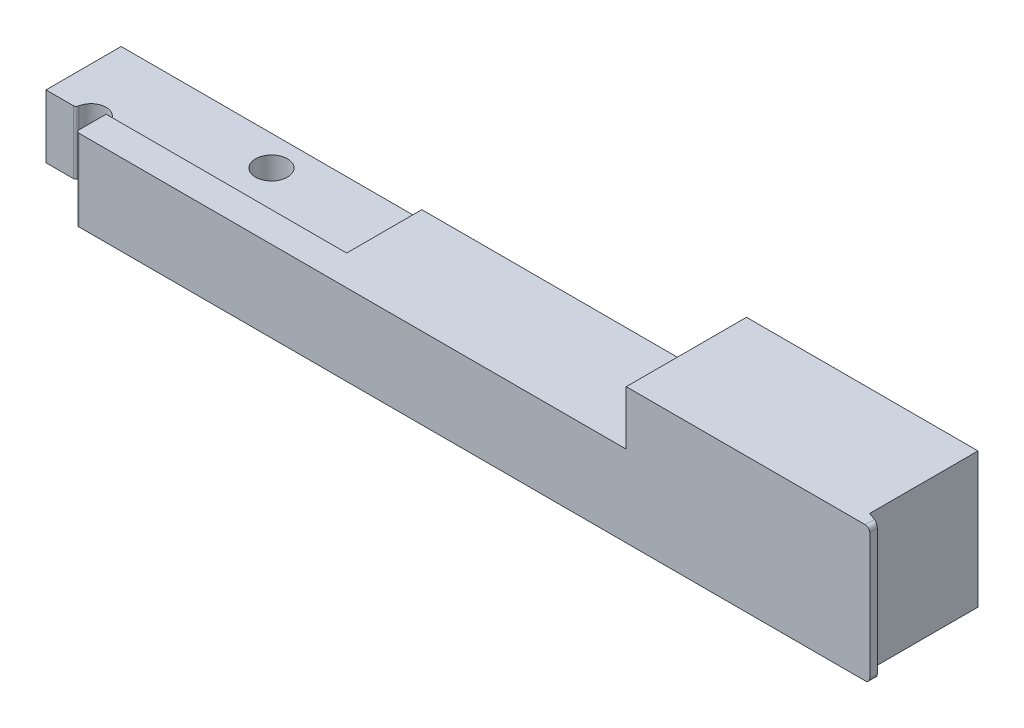
ISO-10303-21;
HEADER;
FILE_DESCRIPTION(('STEP AP214'),'2;1');
FILE_NAME('part.step','',(''),(''),'','','');
FILE_SCHEMA(('AUTOMOTIVE_DESIGN { 1 0 10303 214 1 1 1 1 }'));
ENDSEC;
DATA;
#1=APPLICATION_CONTEXT('core data for automotive mechanical design processes');
#2=APPLICATION_PROTOCOL_DEFINITION('international standard','automotive_design',2000,#1);
#3=PRODUCT_CONTEXT('',#1,'mechanical');
#4=PRODUCT('Part','Part','',(#3));
#5=PRODUCT_RELATED_PRODUCT_CATEGORY('part','',(#4));
#6=PRODUCT_DEFINITION_FORMATION('','',#4);
#7=PRODUCT_DEFINITION_CONTEXT('part definition',#1,'design');
#8=PRODUCT_DEFINITION('design','',#6,#7);
#9=PRODUCT_DEFINITION_SHAPE('','',#8);
#10=(LENGTH_UNIT() NAMED_UNIT(*) SI_UNIT(.MILLI.,.METRE.));
#11=(NAMED_UNIT(*) PLANE_ANGLE_UNIT() SI_UNIT($,.RADIAN.));
#12=(NAMED_UNIT(*) SI_UNIT($,.STERADIAN.) SOLID_ANGLE_UNIT());
#13=UNCERTAINTY_MEASURE_WITH_UNIT(LENGTH_MEASURE(1.E-05),#10,'distance_accuracy_value','');
#14=(GEOMETRIC_REPRESENTATION_CONTEXT(3) GLOBAL_UNCERTAINTY_ASSIGNED_CONTEXT((#13)) GLOBAL_UNIT_ASSIGNED_CONTEXT((#10,
#11,#12)) REPRESENTATION_CONTEXT('',''));
#15=CARTESIAN_POINT('',(0.,0.,0.));
#16=DIRECTION('',(0.,0.,1.));
#17=DIRECTION('',(1.,0.,0.));
#18=AXIS2_PLACEMENT_3D('',#15,#16,#17);
#19=CARTESIAN_POINT('',(0.,0.,-20.));
#20=DIRECTION('',(1.,0.,0.));
#21=DIRECTION('',(0.,0.,-1.));
#22=AXIS2_PLACEMENT_3D('',#19,#20,#21);
#23=PLANE('',#22);
#24=DIRECTION('',(0.,0.,1.));
#25=VECTOR('',#24,1.);
#26=CARTESIAN_POINT('',(0.,1.5,-17.5));
#27=LINE('',#26,#25);
#28=CARTESIAN_POINT('',(0.,1.5,-17.5));
#29=VERTEX_POINT('',#28);
#30=CARTESIAN_POINT('',(0.,1.5,-5.));
#31=VERTEX_POINT('',#30);
#32=EDGE_CURVE('E196',#29,#31,#27,.T.);
#33=ORIENTED_EDGE('',*,*,#32,.T.);
#34=DIRECTION('',(0.,1.,0.));
#35=VECTOR('',#34,1.);
#36=CARTESIAN_POINT('',(0.,-0.00100000000003569,-5.));
#37=LINE('',#36,#35);
#38=CARTESIAN_POINT('',(0.,12.,-5.));
#39=VERTEX_POINT('',#38);
#40=EDGE_CURVE('E325',#31,#39,#37,.T.);
#41=ORIENTED_EDGE('',*,*,#40,.T.);
#42=DIRECTION('',(0.,0.,1.));
#43=VECTOR('',#42,1.);
#44=CARTESIAN_POINT('',(0.,12.,-17.5));
#45=LINE('',#44,#43);
#46=CARTESIAN_POINT('',(0.,12.,-17.5));
#47=VERTEX_POINT('',#46);
#48=EDGE_CURVE('E221',#47,#39,#45,.T.);
#49=ORIENTED_EDGE('',*,*,#48,.F.);
#50=DIRECTION('',(0.,1.,0.));
#51=VECTOR('',#50,1.);
#52=CARTESIAN_POINT('',(0.,0.,-17.5));
#53=LINE('',#52,#51);
#54=EDGE_CURVE('E213',#29,#47,#53,.T.);
#55=ORIENTED_EDGE('',*,*,#54,.F.);
#56=EDGE_LOOP('',(#33,#41,#49,#55));
#57=FACE_BOUND('',#56,.T.);
#58=ADVANCED_FACE('F47',(#57),#23,.F.);
#59=CARTESIAN_POINT('',(30.,-0.00100000000003223,-12.5));
#60=DIRECTION('',(0.,1.,0.));
#61=DIRECTION('',(-1.,0.,0.));
#62=AXIS2_PLACEMENT_3D('',#59,#60,#61);
#63=CYLINDRICAL_SURFACE('',#62,2.65);
#64=CARTESIAN_POINT('',(30.,12.,-12.5));
#65=DIRECTION('',(0.,1.,0.));
#66=DIRECTION('',(0.,0.,1.));
#67=AXIS2_PLACEMENT_3D('',#64,#65,#66);
#68=CIRCLE('',#67,2.65);
#69=CARTESIAN_POINT('',(30.,12.,-9.85));
#70=VERTEX_POINT('',#69);
#71=EDGE_CURVE('E389',#70,#70,#68,.F.);
#72=ORIENTED_EDGE('',*,*,#71,.F.);
#73=EDGE_LOOP('',(#72));
#74=FACE_BOUND('',#73,.T.);
#75=CARTESIAN_POINT('',(30.,1.5,-12.5));
#76=DIRECTION('',(0.,-1.,0.));
#77=DIRECTION('',(1.,0.,0.));
#78=AXIS2_PLACEMENT_3D('',#75,#76,#77);
#79=CIRCLE('',#78,2.65);
#80=CARTESIAN_POINT('',(32.65,1.5,-12.5));
#81=VERTEX_POINT('',#80);
#82=EDGE_CURVE('E475',#81,#81,#79,.F.);
#83=ORIENTED_EDGE('',*,*,#82,.F.);
#84=EDGE_LOOP('',(#83));
#85=FACE_BOUND('',#84,.T.);
#86=ADVANCED_FACE('F418',(#74,#85),#63,.F.);
#87=CARTESIAN_POINT('',(7.5,-0.00100000000003569,-5.));
#88=DIRECTION('',(0.,1.,0.));
#89=DIRECTION('',(-1.,0.,0.));
#90=AXIS2_PLACEMENT_3D('',#87,#88,#89);
#91=CYLINDRICAL_SURFACE('',#90,2.5);
#92=CARTESIAN_POINT('',(7.5,1.5,-5.));
#93=DIRECTION('',(0.,-1.,0.));
#94=DIRECTION('',(1.,0.,0.));
#95=AXIS2_PLACEMENT_3D('',#92,#93,#94);
#96=CIRCLE('',#95,2.5);
#97=CARTESIAN_POINT('',(10.,1.5,-5.));
#98=VERTEX_POINT('',#97);
#99=CARTESIAN_POINT('',(5.03496675704183,1.5,-5.41666666666667));
#100=VERTEX_POINT('',#99);
#101=EDGE_CURVE('E485',#98,#100,#96,.F.);
#102=ORIENTED_EDGE('',*,*,#101,.F.);
#103=DIRECTION('',(0.,1.,0.));
#104=VECTOR('',#103,1.);
#105=CARTESIAN_POINT('',(10.,-0.00100000000003569,-5.));
#106=LINE('',#105,#104);
#107=CARTESIAN_POINT('',(10.,12.,-5.));
#108=VERTEX_POINT('',#107);
#109=EDGE_CURVE('E329',#98,#108,#106,.T.);
#110=ORIENTED_EDGE('',*,*,#109,.T.);
#111=CARTESIAN_POINT('',(7.5,12.,-5.));
#112=DIRECTION('',(0.,1.,0.));
#113=DIRECTION('',(0.,0.,1.));
#114=AXIS2_PLACEMENT_3D('',#111,#112,#113);
#115=CIRCLE('',#114,2.5);
#116=CARTESIAN_POINT('',(5.03496675704183,12.,-5.41666666666667));
#117=VERTEX_POINT('',#116);
#118=EDGE_CURVE('E479',#117,#108,#115,.F.);
#119=ORIENTED_EDGE('',*,*,#118,.F.);
#120=DIRECTION('',(0.,1.,0.));
#121=VECTOR('',#120,1.);
#122=CARTESIAN_POINT('',(5.03496675704183,-0.001000000000036,-5.41666666666667));
#123=LINE('',#122,#121);
#124=EDGE_CURVE('E293',#117,#100,#123,.F.);
#125=ORIENTED_EDGE('',*,*,#124,.T.);
#126=EDGE_LOOP('',(#102,#110,#119,#125));
#127=FACE_BOUND('',#126,.T.);
#128=ADVANCED_FACE('F424',(#127),#91,.F.);
#129=CARTESIAN_POINT('',(0.,-0.00100000000003569,-5.));
#130=DIRECTION('',(0.,0.,-1.));
#131=DIRECTION('',(-1.,0.,0.));
#132=AXIS2_PLACEMENT_3D('',#129,#130,#131);
#133=PLANE('',#132);
#134=DIRECTION('',(1.,0.,0.));
#135=VECTOR('',#134,1.);
#136=CARTESIAN_POINT('',(0.,1.5,-5.));
#137=LINE('',#136,#135);
#138=CARTESIAN_POINT('',(4.54196010845019,1.5,-5.));
#139=VERTEX_POINT('',#138);
#140=EDGE_CURVE('E204',#31,#139,#137,.T.);
#141=ORIENTED_EDGE('',*,*,#140,.T.);
#142=DIRECTION('',(0.,1.,0.));
#143=VECTOR('',#142,1.);
#144=CARTESIAN_POINT('',(4.54196010845019,-0.00100000000003514,-5.));
#145=LINE('',#144,#143);
#146=CARTESIAN_POINT('',(4.54196010845019,12.,-5.));
#147=VERTEX_POINT('',#146);
#148=EDGE_CURVE('E291',#139,#147,#145,.T.);
#149=ORIENTED_EDGE('',*,*,#148,.T.);
#150=DIRECTION('',(1.,0.,0.));
#151=VECTOR('',#150,1.);
#152=CARTESIAN_POINT('',(0.,12.,-5.));
#153=LINE('',#152,#151);
#154=EDGE_CURVE('E457',#39,#147,#153,.T.);
#155=ORIENTED_EDGE('',*,*,#154,.F.);
#156=ORIENTED_EDGE('',*,*,#40,.F.);
#157=EDGE_LOOP('',(#141,#149,#155,#156));
#158=FACE_BOUND('',#157,.T.);
#159=ADVANCED_FACE('F442',(#158),#133,.F.);
#160=CARTESIAN_POINT('',(4.54196010845019,-0.00100000000003606,-5.5));
#161=DIRECTION('',(0.,1.,0.));
#162=DIRECTION('',(-1.,0.,0.));
#163=AXIS2_PLACEMENT_3D('',#160,#161,#162);
#164=CYLINDRICAL_SURFACE('',#163,0.5);
#165=ORIENTED_EDGE('',*,*,#148,.F.);
#166=CARTESIAN_POINT('',(4.54196010845019,1.5,-5.5));
#167=DIRECTION('',(0.,-1.,0.));
#168=DIRECTION('',(1.,0.,0.));
#169=AXIS2_PLACEMENT_3D('',#166,#167,#168);
#170=CIRCLE('',#169,0.5);
#171=EDGE_CURVE('E454',#139,#100,#170,.F.);
#172=ORIENTED_EDGE('',*,*,#171,.T.);
#173=ORIENTED_EDGE('',*,*,#124,.F.);
#174=CARTESIAN_POINT('',(4.54196010845019,12.,-5.5));
#175=DIRECTION('',(0.,1.,0.));
#176=DIRECTION('',(0.,0.,1.));
#177=AXIS2_PLACEMENT_3D('',#174,#175,#176);
#178=CIRCLE('',#177,0.5);
#179=EDGE_CURVE('E11',#117,#147,#178,.F.);
#180=ORIENTED_EDGE('',*,*,#179,.T.);
#181=EDGE_LOOP('',(#165,#172,#173,#180));
#182=FACE_BOUND('',#181,.T.);
#183=ADVANCED_FACE('F440',(#182),#164,.T.);
#184=CARTESIAN_POINT('',(0.,0.,-20.));
#185=DIRECTION('',(0.,-1.,0.));
#186=DIRECTION('',(1.,0.,0.));
#187=AXIS2_PLACEMENT_3D('',#184,#185,#186);
#188=PLANE('',#187);
#189=DIRECTION('',(0.,0.,-1.));
#190=VECTOR('',#189,1.);
#191=CARTESIAN_POINT('',(10.,0.,0.));
#192=LINE('',#191,#190);
#193=CARTESIAN_POINT('',(10.,0.,-0.5));
#194=VERTEX_POINT('',#193);
#195=CARTESIAN_POINT('',(10.,0.,-5.));
#196=VERTEX_POINT('',#195);
#197=EDGE_CURVE('E327',#194,#196,#192,.T.);
#198=ORIENTED_EDGE('',*,*,#197,.T.);
#199=DIRECTION('',(1.,0.,0.));
#200=VECTOR('',#199,1.);
#201=CARTESIAN_POINT('',(0.,0.,-5.));
#202=LINE('',#201,#200);
#203=CARTESIAN_POINT('',(50.,0.,-5.00000000000001));
#204=VERTEX_POINT('',#203);
#205=EDGE_CURVE('E208',#196,#204,#202,.T.);
#206=ORIENTED_EDGE('',*,*,#205,.T.);
#207=DIRECTION('',(0.,0.,-1.));
#208=VECTOR('',#207,1.);
#209=CARTESIAN_POINT('',(50.,0.,-17.5));
#210=LINE('',#209,#208);
#211=CARTESIAN_POINT('',(50.,0.,-17.5));
#212=VERTEX_POINT('',#211);
#213=EDGE_CURVE('E494',#204,#212,#210,.T.);
#214=ORIENTED_EDGE('',*,*,#213,.T.);
#215=DIRECTION('',(1.,0.,0.));
#216=VECTOR('',#215,1.);
#217=CARTESIAN_POINT('',(100.,0.,-17.5));
#218=LINE('',#217,#216);
#219=CARTESIAN_POINT('',(100.,0.,-17.5));
#220=VERTEX_POINT('',#219);
#221=EDGE_CURVE('E337',#212,#220,#218,.T.);
#222=ORIENTED_EDGE('',*,*,#221,.T.);
#223=DIRECTION('',(0.514495755427527,0.,-0.857492925712544));
#224=VECTOR('',#223,1.);
#225=CARTESIAN_POINT('',(100.,0.,-17.5));
#226=LINE('',#225,#224);
#227=CARTESIAN_POINT('',(101.5,0.,-20.));
#228=VERTEX_POINT('',#227);
#229=EDGE_CURVE('E231',#220,#228,#226,.T.);
#230=ORIENTED_EDGE('',*,*,#229,.T.);
#231=DIRECTION('',(1.,0.,0.));
#232=VECTOR('',#231,1.);
#233=CARTESIAN_POINT('',(0.,0.,-20.));
#234=LINE('',#233,#232);
#235=CARTESIAN_POINT('',(140.,0.,-20.));
#236=VERTEX_POINT('',#235);
#237=EDGE_CURVE('E244',#228,#236,#234,.T.);
#238=ORIENTED_EDGE('',*,*,#237,.T.);
#239=DIRECTION('',(0.,0.,1.));
#240=VECTOR('',#239,1.);
#241=CARTESIAN_POINT('',(140.,0.,-20.));
#242=LINE('',#241,#240);
#243=CARTESIAN_POINT('',(140.,0.,-1.97794046853239));
#244=VERTEX_POINT('',#243);
#245=EDGE_CURVE('E222',#236,#244,#242,.T.);
#246=ORIENTED_EDGE('',*,*,#245,.T.);
#247=DIRECTION('',(-0.939692620785909,0.,-0.342020143325667));
#248=VECTOR('',#247,1.);
#249=CARTESIAN_POINT('',(10.5847106977411,0.,-49.0812536335036));
#250=LINE('',#249,#248);
#251=CARTESIAN_POINT('',(141.25,0.,-1.52297767569964));
#252=VERTEX_POINT('',#251);
#253=EDGE_CURVE('E257',#244,#252,#250,.F.);
#254=ORIENTED_EDGE('',*,*,#253,.T.);
#255=DIRECTION('',(0.,0.,1.));
#256=VECTOR('',#255,1.);
#257=CARTESIAN_POINT('',(141.25,0.,-20.));
#258=LINE('',#257,#256);
#259=CARTESIAN_POINT('',(141.25,0.,0.));
#260=VERTEX_POINT('',#259);
#261=EDGE_CURVE('E263',#252,#260,#258,.T.);
#262=ORIENTED_EDGE('',*,*,#261,.T.);
#263=DIRECTION('',(1.,0.,0.));
#264=VECTOR('',#263,1.);
#265=CARTESIAN_POINT('',(0.,0.,0.));
#266=LINE('',#265,#264);
#267=CARTESIAN_POINT('',(10.5,0.,0.));
#268=VERTEX_POINT('',#267);
#269=EDGE_CURVE('E245',#268,#260,#266,.T.);
#270=ORIENTED_EDGE('',*,*,#269,.F.);
#271=CARTESIAN_POINT('',(10.5,0.,-0.5));
#272=DIRECTION('',(0.,-1.,0.));
#273=DIRECTION('',(1.,0.,0.));
#274=AXIS2_PLACEMENT_3D('',#271,#272,#273);
#275=CIRCLE('',#274,0.5);
#276=EDGE_CURVE('E70',#268,#194,#275,.T.);
#277=ORIENTED_EDGE('',*,*,#276,.T.);
#278=EDGE_LOOP('',(#198,#206,#214,#222,#230,#238,#246,#254,#262,#270,#277));
#279=FACE_BOUND('',#278,.T.);
#280=ADVANCED_FACE('F343',(#279),#188,.T.);
#281=CARTESIAN_POINT('',(100.,0.,-17.5));
#282=DIRECTION('',(0.,0.,1.));
#283=DIRECTION('',(1.,0.,0.));
#284=AXIS2_PLACEMENT_3D('',#281,#282,#283);
#285=PLANE('',#284);
#286=DIRECTION('',(0.,-1.,0.));
#287=VECTOR('',#286,1.);
#288=CARTESIAN_POINT('',(50.,1.50000000000001,-17.5));
#289=LINE('',#288,#287);
#290=CARTESIAN_POINT('',(50.,1.50000000000001,-17.5));
#291=VERTEX_POINT('',#290);
#292=EDGE_CURVE('E216',#291,#212,#289,.T.);
#293=ORIENTED_EDGE('',*,*,#292,.F.);
#294=DIRECTION('',(-1.,0.,0.));
#295=VECTOR('',#294,1.);
#296=CARTESIAN_POINT('',(0.,1.5,-17.5));
#297=LINE('',#296,#295);
#298=EDGE_CURVE('E201',#291,#29,#297,.T.);
#299=ORIENTED_EDGE('',*,*,#298,.T.);
#300=ORIENTED_EDGE('',*,*,#54,.T.);
#301=DIRECTION('',(-1.,0.,0.));
#302=VECTOR('',#301,1.);
#303=CARTESIAN_POINT('',(0.,12.,-17.5));
#304=LINE('',#303,#302);
#305=CARTESIAN_POINT('',(50.,12.,-17.5));
#306=VERTEX_POINT('',#305);
#307=EDGE_CURVE('E467',#306,#47,#304,.T.);
#308=ORIENTED_EDGE('',*,*,#307,.F.);
#309=DIRECTION('',(0.,1.,0.));
#310=VECTOR('',#309,1.);
#311=CARTESIAN_POINT('',(50.,12.,-17.5));
#312=LINE('',#311,#310);
#313=CARTESIAN_POINT('',(50.,13.5,-17.5));
#314=VERTEX_POINT('',#313);
#315=EDGE_CURVE('E400',#306,#314,#312,.T.);
#316=ORIENTED_EDGE('',*,*,#315,.T.);
#317=DIRECTION('',(-1.,0.,0.));
#318=VECTOR('',#317,1.);
#319=CARTESIAN_POINT('',(0.,13.5,-17.5));
#320=LINE('',#319,#318);
#321=CARTESIAN_POINT('',(100.,13.5,-17.5));
#322=VERTEX_POINT('',#321);
#323=EDGE_CURVE('E317',#322,#314,#320,.T.);
#324=ORIENTED_EDGE('',*,*,#323,.F.);
#325=DIRECTION('',(0.,1.,0.));
#326=VECTOR('',#325,1.);
#327=CARTESIAN_POINT('',(100.,0.,-17.5));
#328=LINE('',#327,#326);
#329=EDGE_CURVE('E228',#220,#322,#328,.T.);
#330=ORIENTED_EDGE('',*,*,#329,.F.);
#331=ORIENTED_EDGE('',*,*,#221,.F.);
#332=EDGE_LOOP('',(#293,#299,#300,#308,#316,#324,#330,#331));
#333=FACE_BOUND('',#332,.T.);
#334=ADVANCED_FACE('F211',(#333),#285,.F.);
#335=CARTESIAN_POINT('',(0.,22.5,-20.));
#336=DIRECTION('',(0.,-1.,0.));
#337=DIRECTION('',(1.,0.,0.));
#338=AXIS2_PLACEMENT_3D('',#335,#336,#337);
#339=PLANE('',#338);
#340=DIRECTION('',(1.,0.,0.));
#341=VECTOR('',#340,1.);
#342=CARTESIAN_POINT('',(0.,22.5,-20.));
#343=LINE('',#342,#341);
#344=CARTESIAN_POINT('',(101.5,22.5,-20.));
#345=VERTEX_POINT('',#344);
#346=CARTESIAN_POINT('',(140.,22.5,-20.));
#347=VERTEX_POINT('',#346);
#348=EDGE_CURVE('E242',#345,#347,#343,.T.);
#349=ORIENTED_EDGE('',*,*,#348,.F.);
#350=DIRECTION('',(0.,0.,1.));
#351=VECTOR('',#350,1.);
#352=CARTESIAN_POINT('',(101.5,22.5,-20.001));
#353=LINE('',#352,#351);
#354=CARTESIAN_POINT('',(101.5,22.5,0.));
#355=VERTEX_POINT('',#354);
#356=EDGE_CURVE('E315',#345,#355,#353,.T.);
#357=ORIENTED_EDGE('',*,*,#356,.T.);
#358=DIRECTION('',(1.,0.,0.));
#359=VECTOR('',#358,1.);
#360=CARTESIAN_POINT('',(0.,22.5,0.));
#361=LINE('',#360,#359);
#362=CARTESIAN_POINT('',(141.25,22.5,0.));
#363=VERTEX_POINT('',#362);
#364=EDGE_CURVE('E241',#355,#363,#361,.T.);
#365=ORIENTED_EDGE('',*,*,#364,.T.);
#366=DIRECTION('',(0.,0.,1.));
#367=VECTOR('',#366,1.);
#368=CARTESIAN_POINT('',(141.25,22.5,-1.24999999999999));
#369=LINE('',#368,#367);
#370=CARTESIAN_POINT('',(141.25,22.5,-1.52297767569964));
#371=VERTEX_POINT('',#370);
#372=EDGE_CURVE('E280',#363,#371,#369,.F.);
#373=ORIENTED_EDGE('',*,*,#372,.T.);
#374=DIRECTION('',(0.939692620785909,0.,0.342020143325667));
#375=VECTOR('',#374,1.);
#376=CARTESIAN_POINT('',(142.,22.5,-1.24999999999999));
#377=LINE('',#376,#375);
#378=CARTESIAN_POINT('',(140.,22.5,-1.97794046853239));
#379=VERTEX_POINT('',#378);
#380=EDGE_CURVE('E255',#371,#379,#377,.F.);
#381=ORIENTED_EDGE('',*,*,#380,.T.);
#382=DIRECTION('',(0.,0.,1.));
#383=VECTOR('',#382,1.);
#384=CARTESIAN_POINT('',(140.,22.5,-20.));
#385=LINE('',#384,#383);
#386=EDGE_CURVE('E225',#347,#379,#385,.T.);
#387=ORIENTED_EDGE('',*,*,#386,.F.);
#388=EDGE_LOOP('',(#349,#357,#365,#373,#381,#387));
#389=FACE_BOUND('',#388,.T.);
#390=ADVANCED_FACE('F356',(#389),#339,.F.);
#391=CARTESIAN_POINT('',(126.5,11.25,-15.));
#392=DIRECTION('',(0.,0.,-1.));
#393=DIRECTION('',(-1.,0.,0.));
#394=AXIS2_PLACEMENT_3D('',#391,#392,#393);
#395=CYLINDRICAL_SURFACE('',#394,2.99999999999999);
#396=CARTESIAN_POINT('',(126.5,11.25,-20.));
#397=DIRECTION('',(0.,0.,-1.));
#398=DIRECTION('',(-1.,0.,0.));
#399=AXIS2_PLACEMENT_3D('',#396,#397,#398);
#400=CIRCLE('',#399,2.99999999999999);
#401=CARTESIAN_POINT('',(123.5,11.25,-20.));
#402=VERTEX_POINT('',#401);
#403=EDGE_CURVE('E335',#402,#402,#400,.T.);
#404=ORIENTED_EDGE('',*,*,#403,.T.);
#405=EDGE_LOOP('',(#404));
#406=FACE_BOUND('',#405,.T.);
#407=CARTESIAN_POINT('',(126.5,11.25,-16.));
#408=DIRECTION('',(0.,0.,-1.));
#409=DIRECTION('',(-1.,0.,0.));
#410=AXIS2_PLACEMENT_3D('',#407,#408,#409);
#411=CIRCLE('',#410,2.99999999999999);
#412=CARTESIAN_POINT('',(123.5,11.25,-16.));
#413=VERTEX_POINT('',#412);
#414=EDGE_CURVE('E282',#413,#413,#411,.T.);
#415=ORIENTED_EDGE('',*,*,#414,.F.);
#416=EDGE_LOOP('',(#415));
#417=FACE_BOUND('',#416,.T.);
#418=ADVANCED_FACE('F537',(#406,#417),#395,.F.);
#419=CARTESIAN_POINT('',(142.,0.,-20.));
#420=DIRECTION('',(1.,0.,0.));
#421=DIRECTION('',(0.,0.,-1.));
#422=AXIS2_PLACEMENT_3D('',#419,#420,#421);
#423=PLANE('',#422);
#424=DIRECTION('',(0.,1.,0.));
#425=VECTOR('',#424,1.);
#426=CARTESIAN_POINT('',(142.,0.,0.));
#427=LINE('',#426,#425);
#428=CARTESIAN_POINT('',(142.,0.750000000000017,0.));
#429=VERTEX_POINT('',#428);
#430=CARTESIAN_POINT('',(142.,21.75,0.));
#431=VERTEX_POINT('',#430);
#432=EDGE_CURVE('E249',#429,#431,#427,.T.);
#433=ORIENTED_EDGE('',*,*,#432,.F.);
#434=DIRECTION('',(0.,0.,1.));
#435=VECTOR('',#434,1.);
#436=CARTESIAN_POINT('',(142.,0.750000000000017,-20.));
#437=LINE('',#436,#435);
#438=CARTESIAN_POINT('',(142.,0.750000000000017,-1.24999999999999));
#439=VERTEX_POINT('',#438);
#440=EDGE_CURVE('E274',#429,#439,#437,.F.);
#441=ORIENTED_EDGE('',*,*,#440,.T.);
#442=DIRECTION('',(0.,1.,0.));
#443=VECTOR('',#442,1.);
#444=CARTESIAN_POINT('',(142.,0.,-1.24999999999999));
#445=LINE('',#444,#443);
#446=CARTESIAN_POINT('',(142.,21.75,-1.24999999999999));
#447=VERTEX_POINT('',#446);
#448=EDGE_CURVE('E247',#439,#447,#445,.T.);
#449=ORIENTED_EDGE('',*,*,#448,.T.);
#450=DIRECTION('',(0.,0.,1.));
#451=VECTOR('',#450,1.);
#452=CARTESIAN_POINT('',(142.,21.75,0.));
#453=LINE('',#452,#451);
#454=EDGE_CURVE('E271',#447,#431,#453,.T.);
#455=ORIENTED_EDGE('',*,*,#454,.T.);
#456=EDGE_LOOP('',(#433,#441,#449,#455));
#457=FACE_BOUND('',#456,.T.);
#458=ADVANCED_FACE('F369',(#457),#423,.T.);
#459=CARTESIAN_POINT('',(0.,0.,-20.));
#460=DIRECTION('',(0.,0.,-1.));
#461=DIRECTION('',(-1.,0.,0.));
#462=AXIS2_PLACEMENT_3D('',#459,#460,#461);
#463=PLANE('',#462);
#464=ORIENTED_EDGE('',*,*,#403,.F.);
#465=EDGE_LOOP('',(#464));
#466=FACE_BOUND('',#465,.T.);
#467=DIRECTION('',(0.,1.,0.));
#468=VECTOR('',#467,1.);
#469=CARTESIAN_POINT('',(101.5,0.,-20.));
#470=LINE('',#469,#468);
#471=CARTESIAN_POINT('',(101.5,13.5,-20.));
#472=VERTEX_POINT('',#471);
#473=EDGE_CURVE('E223',#228,#472,#470,.T.);
#474=ORIENTED_EDGE('',*,*,#473,.T.);
#475=DIRECTION('',(0.,1.,0.));
#476=VECTOR('',#475,1.);
#477=CARTESIAN_POINT('',(101.5,0.,-20.));
#478=LINE('',#477,#476);
#479=EDGE_CURVE('E385',#472,#345,#478,.T.);
#480=ORIENTED_EDGE('',*,*,#479,.T.);
#481=ORIENTED_EDGE('',*,*,#348,.T.);
#482=DIRECTION('',(0.,1.,0.));
#483=VECTOR('',#482,1.);
#484=CARTESIAN_POINT('',(140.,0.,-20.));
#485=LINE('',#484,#483);
#486=EDGE_CURVE('E238',#236,#347,#485,.T.);
#487=ORIENTED_EDGE('',*,*,#486,.F.);
#488=ORIENTED_EDGE('',*,*,#237,.F.);
#489=EDGE_LOOP('',(#474,#480,#481,#487,#488));
#490=FACE_BOUND('',#489,.T.);
#491=ADVANCED_FACE('F348',(#466,#490),#463,.T.);
#492=CARTESIAN_POINT('',(0.,0.,0.));
#493=DIRECTION('',(0.,0.,-1.));
#494=DIRECTION('',(-1.,0.,0.));
#495=AXIS2_PLACEMENT_3D('',#492,#493,#494);
#496=PLANE('',#495);
#497=ORIENTED_EDGE('',*,*,#364,.F.);
#498=DIRECTION('',(0.,1.,0.));
#499=VECTOR('',#498,1.);
#500=CARTESIAN_POINT('',(101.5,22.5,0.));
#501=LINE('',#500,#499);
#502=CARTESIAN_POINT('',(101.5,13.5,0.));
#503=VERTEX_POINT('',#502);
#504=EDGE_CURVE('E387',#503,#355,#501,.T.);
#505=ORIENTED_EDGE('',*,*,#504,.F.);
#506=DIRECTION('',(1.,0.,0.));
#507=VECTOR('',#506,1.);
#508=CARTESIAN_POINT('',(0.,13.5,0.));
#509=LINE('',#508,#507);
#510=CARTESIAN_POINT('',(10.5,13.5,0.));
#511=VERTEX_POINT('',#510);
#512=EDGE_CURVE('E384',#511,#503,#509,.T.);
#513=ORIENTED_EDGE('',*,*,#512,.F.);
#514=DIRECTION('',(0.,1.,0.));
#515=VECTOR('',#514,1.);
#516=CARTESIAN_POINT('',(10.5,0.,0.));
#517=LINE('',#516,#515);
#518=EDGE_CURVE('E300',#511,#268,#517,.F.);
#519=ORIENTED_EDGE('',*,*,#518,.T.);
#520=ORIENTED_EDGE('',*,*,#269,.T.);
#521=CARTESIAN_POINT('',(141.25,0.750000000000017,0.));
#522=DIRECTION('',(0.,0.,-1.));
#523=DIRECTION('',(-1.,0.,0.));
#524=AXIS2_PLACEMENT_3D('',#521,#522,#523);
#525=CIRCLE('',#524,0.75);
#526=EDGE_CURVE('E269',#260,#429,#525,.F.);
#527=ORIENTED_EDGE('',*,*,#526,.T.);
#528=ORIENTED_EDGE('',*,*,#432,.T.);
#529=CARTESIAN_POINT('',(141.25,21.75,0.));
#530=DIRECTION('',(0.,0.,-1.));
#531=DIRECTION('',(-1.,0.,0.));
#532=AXIS2_PLACEMENT_3D('',#529,#530,#531);
#533=CIRCLE('',#532,0.75);
#534=EDGE_CURVE('E266',#431,#363,#533,.F.);
#535=ORIENTED_EDGE('',*,*,#534,.T.);
#536=EDGE_LOOP('',(#497,#505,#513,#519,#520,#527,#528,#535));
#537=FACE_BOUND('',#536,.T.);
#538=ADVANCED_FACE('F373',(#537),#496,.F.);
#539=CARTESIAN_POINT('',(140.,0.,0.));
#540=DIRECTION('',(-1.,0.,0.));
#541=DIRECTION('',(0.,0.,1.));
#542=AXIS2_PLACEMENT_3D('',#539,#540,#541);
#543=PLANE('',#542);
#544=ORIENTED_EDGE('',*,*,#245,.F.);
#545=ORIENTED_EDGE('',*,*,#486,.T.);
#546=ORIENTED_EDGE('',*,*,#386,.T.);
#547=DIRECTION('',(0.,1.,0.));
#548=VECTOR('',#547,1.);
#549=CARTESIAN_POINT('',(140.,0.,-1.97794046853239));
#550=LINE('',#549,#548);
#551=EDGE_CURVE('E260',#379,#244,#550,.F.);
#552=ORIENTED_EDGE('',*,*,#551,.T.);
#553=EDGE_LOOP('',(#544,#545,#546,#552));
#554=FACE_BOUND('',#553,.T.);
#555=ADVANCED_FACE('F353',(#554),#543,.F.);
#556=CARTESIAN_POINT('',(142.,0.,-1.24999999999999));
#557=DIRECTION('',(-0.342020143325667,0.,0.939692620785909));
#558=DIRECTION('',(0.,1.,0.));
#559=AXIS2_PLACEMENT_3D('',#556,#557,#558);
#560=PLANE('',#559);
#561=ORIENTED_EDGE('',*,*,#448,.F.);
#562=CARTESIAN_POINT('',(141.25,0.750000000000017,-1.52297767569964));
#563=DIRECTION('',(-0.342020143325667,0.,0.939692620785909));
#564=DIRECTION('',(0.939692620785909,0.,0.342020143325667));
#565=AXIS2_PLACEMENT_3D('',#562,#563,#564);
#566=ELLIPSE('',#565,0.798133329356934,0.75);
#567=EDGE_CURVE('E278',#439,#252,#566,.F.);
#568=ORIENTED_EDGE('',*,*,#567,.T.);
#569=ORIENTED_EDGE('',*,*,#253,.F.);
#570=ORIENTED_EDGE('',*,*,#551,.F.);
#571=ORIENTED_EDGE('',*,*,#380,.F.);
#572=CARTESIAN_POINT('',(141.25,21.75,-1.52297767569964));
#573=DIRECTION('',(-0.342020143325667,0.,0.939692620785909));
#574=DIRECTION('',(-0.939692620785909,0.,-0.342020143325667));
#575=AXIS2_PLACEMENT_3D('',#572,#573,#574);
#576=ELLIPSE('',#575,0.798133329356934,0.75);
#577=EDGE_CURVE('E276',#371,#447,#576,.F.);
#578=ORIENTED_EDGE('',*,*,#577,.T.);
#579=EDGE_LOOP('',(#561,#568,#569,#570,#571,#578));
#580=FACE_BOUND('',#579,.T.);
#581=ADVANCED_FACE('F362',(#580),#560,.F.);
#582=CARTESIAN_POINT('',(141.25,0.750000000000017,-20.));
#583=DIRECTION('',(0.,0.,1.));
#584=DIRECTION('',(1.,0.,0.));
#585=AXIS2_PLACEMENT_3D('',#582,#583,#584);
#586=CYLINDRICAL_SURFACE('',#585,0.75);
#587=ORIENTED_EDGE('',*,*,#567,.F.);
#588=ORIENTED_EDGE('',*,*,#440,.F.);
#589=ORIENTED_EDGE('',*,*,#526,.F.);
#590=ORIENTED_EDGE('',*,*,#261,.F.);
#591=EDGE_LOOP('',(#587,#588,#589,#590));
#592=FACE_BOUND('',#591,.T.);
#593=ADVANCED_FACE('F378',(#592),#586,.T.);
#594=CARTESIAN_POINT('',(141.25,21.75,-20.));
#595=DIRECTION('',(0.,0.,-1.));
#596=DIRECTION('',(-1.,0.,0.));
#597=AXIS2_PLACEMENT_3D('',#594,#595,#596);
#598=CYLINDRICAL_SURFACE('',#597,0.75);
#599=ORIENTED_EDGE('',*,*,#577,.F.);
#600=ORIENTED_EDGE('',*,*,#372,.F.);
#601=ORIENTED_EDGE('',*,*,#534,.F.);
#602=ORIENTED_EDGE('',*,*,#454,.F.);
#603=EDGE_LOOP('',(#599,#600,#601,#602));
#604=FACE_BOUND('',#603,.T.);
#605=ADVANCED_FACE('F366',(#604),#598,.T.);
#606=CARTESIAN_POINT('',(100.,0.,-17.5));
#607=DIRECTION('',(0.857492925712544,0.,0.514495755427527));
#608=DIRECTION('',(0.514495755427527,0.,-0.857492925712544));
#609=AXIS2_PLACEMENT_3D('',#606,#607,#608);
#610=PLANE('',#609);
#611=ORIENTED_EDGE('',*,*,#329,.T.);
#612=DIRECTION('',(-0.514495755427527,0.,0.857492925712544));
#613=VECTOR('',#612,1.);
#614=CARTESIAN_POINT('',(74.632794117647,13.5,24.7786764705883));
#615=LINE('',#614,#613);
#616=EDGE_CURVE('E314',#472,#322,#615,.T.);
#617=ORIENTED_EDGE('',*,*,#616,.F.);
#618=ORIENTED_EDGE('',*,*,#473,.F.);
#619=ORIENTED_EDGE('',*,*,#229,.F.);
#620=EDGE_LOOP('',(#611,#617,#618,#619));
#621=FACE_BOUND('',#620,.T.);
#622=ADVANCED_FACE('F401',(#621),#610,.F.);
#623=CARTESIAN_POINT('',(126.5,11.25,-15.));
#624=DIRECTION('',(0.,0.,1.));
#625=DIRECTION('',(1.,0.,0.));
#626=AXIS2_PLACEMENT_3D('',#623,#624,#625);
#627=CONICAL_SURFACE('',#626,3.,0.785398163397428);
#628=CARTESIAN_POINT('',(126.5,11.25,-15.2171572875254));
#629=DIRECTION('',(0.,0.,-1.));
#630=DIRECTION('',(-1.,0.,0.));
#631=AXIS2_PLACEMENT_3D('',#628,#629,#630);
#632=CIRCLE('',#631,2.78284271247463);
#633=CARTESIAN_POINT('',(123.717157287525,11.25,-15.2171572875254));
#634=VERTEX_POINT('',#633);
#635=EDGE_CURVE('E288',#634,#634,#632,.T.);
#636=ORIENTED_EDGE('',*,*,#635,.T.);
#637=EDGE_LOOP('',(#636));
#638=FACE_BOUND('',#637,.T.);
#639=CARTESIAN_POINT('',(126.5,11.25,-15.));
#640=DIRECTION('',(0.,0.,1.));
#641=DIRECTION('',(1.,0.,0.));
#642=AXIS2_PLACEMENT_3D('',#639,#640,#641);
#643=CIRCLE('',#642,3.);
#644=CARTESIAN_POINT('',(129.5,11.25,-15.));
#645=VERTEX_POINT('',#644);
#646=EDGE_CURVE('E332',#645,#645,#643,.T.);
#647=ORIENTED_EDGE('',*,*,#646,.T.);
#648=EDGE_LOOP('',(#647));
#649=FACE_BOUND('',#648,.T.);
#650=ADVANCED_FACE('F403',(#638,#649),#627,.F.);
#651=CARTESIAN_POINT('',(126.5,11.25,-15.5));
#652=DIRECTION('',(0.,0.,-1.));
#653=DIRECTION('',(-1.,0.,0.));
#654=AXIS2_PLACEMENT_3D('',#651,#652,#653);
#655=CONICAL_SURFACE('',#654,2.50000000000002,0.785398163397436);
#656=CARTESIAN_POINT('',(126.5,11.25,-15.7828427124746));
#657=DIRECTION('',(0.,0.,1.));
#658=DIRECTION('',(1.,0.,0.));
#659=AXIS2_PLACEMENT_3D('',#656,#657,#658);
#660=CIRCLE('',#659,2.78284271247463);
#661=CARTESIAN_POINT('',(129.282842712475,11.25,-15.7828427124746));
#662=VERTEX_POINT('',#661);
#663=EDGE_CURVE('E285',#662,#662,#660,.T.);
#664=ORIENTED_EDGE('',*,*,#663,.T.);
#665=EDGE_LOOP('',(#664));
#666=FACE_BOUND('',#665,.T.);
#667=ORIENTED_EDGE('',*,*,#414,.T.);
#668=EDGE_LOOP('',(#667));
#669=FACE_BOUND('',#668,.T.);
#670=ADVANCED_FACE('F410',(#666,#669),#655,.F.);
#671=CARTESIAN_POINT('',(126.5,11.25,-15.));
#672=DIRECTION('',(0.,0.,-1.));
#673=DIRECTION('',(-1.,0.,0.));
#674=AXIS2_PLACEMENT_3D('',#671,#672,#673);
#675=PLANE('',#674);
#676=ORIENTED_EDGE('',*,*,#646,.F.);
#677=EDGE_LOOP('',(#676));
#678=FACE_BOUND('',#677,.T.);
#679=ADVANCED_FACE('F438',(#678),#675,.T.);
#680=CARTESIAN_POINT('',(126.5,11.25,-15.5));
#681=DIRECTION('',(0.,0.,-1.));
#682=DIRECTION('',(-1.,0.,0.));
#683=AXIS2_PLACEMENT_3D('',#680,#681,#682);
#684=TOROIDAL_SURFACE('',#683,3.06568542494925,0.4);
#685=ORIENTED_EDGE('',*,*,#635,.F.);
#686=EDGE_LOOP('',(#685));
#687=FACE_BOUND('',#686,.T.);
#688=ORIENTED_EDGE('',*,*,#663,.F.);
#689=EDGE_LOOP('',(#688));
#690=FACE_BOUND('',#689,.T.);
#691=ADVANCED_FACE('F436',(#687,#690),#684,.T.);
#692=CARTESIAN_POINT('',(10.,-0.00100000000003569,0.));
#693=DIRECTION('',(1.,0.,0.));
#694=DIRECTION('',(0.,0.,-1.));
#695=AXIS2_PLACEMENT_3D('',#692,#693,#694);
#696=PLANE('',#695);
#697=DIRECTION('',(0.,1.,0.));
#698=VECTOR('',#697,1.);
#699=CARTESIAN_POINT('',(10.,-0.00100000000003569,-0.5));
#700=LINE('',#699,#698);
#701=CARTESIAN_POINT('',(10.,13.5,-0.5));
#702=VERTEX_POINT('',#701);
#703=EDGE_CURVE('E297',#194,#702,#700,.T.);
#704=ORIENTED_EDGE('',*,*,#703,.T.);
#705=DIRECTION('',(0.,0.,1.));
#706=VECTOR('',#705,1.);
#707=CARTESIAN_POINT('',(9.99999999999999,13.5,-20.001));
#708=LINE('',#707,#706);
#709=CARTESIAN_POINT('',(10.,13.5,-5.));
#710=VERTEX_POINT('',#709);
#711=EDGE_CURVE('E62',#710,#702,#708,.T.);
#712=ORIENTED_EDGE('',*,*,#711,.F.);
#713=DIRECTION('',(0.,-1.,0.));
#714=VECTOR('',#713,1.);
#715=CARTESIAN_POINT('',(10.,-0.00100000000003569,-5.));
#716=LINE('',#715,#714);
#717=EDGE_CURVE('E312',#710,#108,#716,.T.);
#718=ORIENTED_EDGE('',*,*,#717,.T.);
#719=ORIENTED_EDGE('',*,*,#109,.F.);
#720=EDGE_CURVE('E330',#196,#98,#106,.T.);
#721=ORIENTED_EDGE('',*,*,#720,.F.);
#722=ORIENTED_EDGE('',*,*,#197,.F.);
#723=EDGE_LOOP('',(#704,#712,#718,#719,#721,#722));
#724=FACE_BOUND('',#723,.T.);
#725=ADVANCED_FACE('F310',(#724),#696,.F.);
#726=CARTESIAN_POINT('',(10.5,-0.00100000000003563,-0.5));
#727=DIRECTION('',(0.,1.,0.));
#728=DIRECTION('',(-1.,0.,0.));
#729=AXIS2_PLACEMENT_3D('',#726,#727,#728);
#730=CYLINDRICAL_SURFACE('',#729,0.5);
#731=CARTESIAN_POINT('',(10.5,13.5,-0.5));
#732=DIRECTION('',(0.,-1.,0.));
#733=DIRECTION('',(0.,0.,-1.));
#734=AXIS2_PLACEMENT_3D('',#731,#732,#733);
#735=CIRCLE('',#734,0.5);
#736=EDGE_CURVE('E381',#511,#702,#735,.T.);
#737=ORIENTED_EDGE('',*,*,#736,.T.);
#738=ORIENTED_EDGE('',*,*,#703,.F.);
#739=ORIENTED_EDGE('',*,*,#276,.F.);
#740=ORIENTED_EDGE('',*,*,#518,.F.);
#741=EDGE_LOOP('',(#737,#738,#739,#740));
#742=FACE_BOUND('',#741,.T.);
#743=ADVANCED_FACE('F49',(#742),#730,.T.);
#744=CARTESIAN_POINT('',(101.5,22.5,-20.001));
#745=DIRECTION('',(1.,0.,0.));
#746=DIRECTION('',(0.,0.,-1.));
#747=AXIS2_PLACEMENT_3D('',#744,#745,#746);
#748=PLANE('',#747);
#749=ORIENTED_EDGE('',*,*,#479,.F.);
#750=DIRECTION('',(0.,0.,1.));
#751=VECTOR('',#750,1.);
#752=CARTESIAN_POINT('',(101.5,13.5,-20.001));
#753=LINE('',#752,#751);
#754=EDGE_CURVE('E320',#472,#503,#753,.T.);
#755=ORIENTED_EDGE('',*,*,#754,.T.);
#756=ORIENTED_EDGE('',*,*,#504,.T.);
#757=ORIENTED_EDGE('',*,*,#356,.F.);
#758=EDGE_LOOP('',(#749,#755,#756,#757));
#759=FACE_BOUND('',#758,.T.);
#760=ADVANCED_FACE('F396',(#759),#748,.F.);
#761=CARTESIAN_POINT('',(0.,13.5,-20.001));
#762=DIRECTION('',(0.,-1.,0.));
#763=DIRECTION('',(0.,0.,-1.));
#764=AXIS2_PLACEMENT_3D('',#761,#762,#763);
#765=PLANE('',#764);
#766=ORIENTED_EDGE('',*,*,#323,.T.);
#767=DIRECTION('',(0.,0.,-1.));
#768=VECTOR('',#767,1.);
#769=CARTESIAN_POINT('',(50.,13.5,-17.5));
#770=LINE('',#769,#768);
#771=CARTESIAN_POINT('',(50.,13.5,-5.00000000000001));
#772=VERTEX_POINT('',#771);
#773=EDGE_CURVE('E304',#772,#314,#770,.T.);
#774=ORIENTED_EDGE('',*,*,#773,.F.);
#775=DIRECTION('',(-1.,0.,0.));
#776=VECTOR('',#775,1.);
#777=CARTESIAN_POINT('',(0.,13.5,-5.));
#778=LINE('',#777,#776);
#779=EDGE_CURVE('E55',#772,#710,#778,.T.);
#780=ORIENTED_EDGE('',*,*,#779,.T.);
#781=ORIENTED_EDGE('',*,*,#711,.T.);
#782=ORIENTED_EDGE('',*,*,#736,.F.);
#783=ORIENTED_EDGE('',*,*,#512,.T.);
#784=ORIENTED_EDGE('',*,*,#754,.F.);
#785=ORIENTED_EDGE('',*,*,#616,.T.);
#786=EDGE_LOOP('',(#766,#774,#780,#781,#782,#783,#784,#785));
#787=FACE_BOUND('',#786,.T.);
#788=ADVANCED_FACE('F303',(#787),#765,.F.);
#789=CARTESIAN_POINT('',(0.,12.,0.));
#790=DIRECTION('',(0.,1.,0.));
#791=DIRECTION('',(0.,0.,1.));
#792=AXIS2_PLACEMENT_3D('',#789,#790,#791);
#793=PLANE('',#792);
#794=ORIENTED_EDGE('',*,*,#118,.T.);
#795=CARTESIAN_POINT('',(50.,12.,-5.00000000000001));
#796=VERTEX_POINT('',#795);
#797=EDGE_CURVE('E464',#108,#796,#153,.T.);
#798=ORIENTED_EDGE('',*,*,#797,.T.);
#799=DIRECTION('',(0.,0.,-1.));
#800=VECTOR('',#799,1.);
#801=CARTESIAN_POINT('',(50.,12.,-17.5));
#802=LINE('',#801,#800);
#803=EDGE_CURVE('E463',#796,#306,#802,.T.);
#804=ORIENTED_EDGE('',*,*,#803,.T.);
#805=ORIENTED_EDGE('',*,*,#307,.T.);
#806=ORIENTED_EDGE('',*,*,#48,.T.);
#807=ORIENTED_EDGE('',*,*,#154,.T.);
#808=ORIENTED_EDGE('',*,*,#179,.F.);
#809=EDGE_LOOP('',(#794,#798,#804,#805,#806,#807,#808));
#810=FACE_BOUND('',#809,.T.);
#811=ORIENTED_EDGE('',*,*,#71,.T.);
#812=EDGE_LOOP('',(#811));
#813=FACE_BOUND('',#812,.T.);
#814=ADVANCED_FACE('F460',(#810,#813),#793,.T.);
#815=CARTESIAN_POINT('',(0.,12.,-5.));
#816=DIRECTION('',(0.,0.,1.));
#817=DIRECTION('',(1.,0.,0.));
#818=AXIS2_PLACEMENT_3D('',#815,#816,#817);
#819=PLANE('',#818);
#820=ORIENTED_EDGE('',*,*,#779,.F.);
#821=DIRECTION('',(0.,1.,0.));
#822=VECTOR('',#821,1.);
#823=CARTESIAN_POINT('',(50.,12.,-5.00000000000001));
#824=LINE('',#823,#822);
#825=EDGE_CURVE('E473',#796,#772,#824,.T.);
#826=ORIENTED_EDGE('',*,*,#825,.F.);
#827=ORIENTED_EDGE('',*,*,#797,.F.);
#828=ORIENTED_EDGE('',*,*,#717,.F.);
#829=EDGE_LOOP('',(#820,#826,#827,#828));
#830=FACE_BOUND('',#829,.T.);
#831=ADVANCED_FACE('F509',(#830),#819,.F.);
#832=CARTESIAN_POINT('',(50.,12.,-17.5));
#833=DIRECTION('',(1.,0.,0.));
#834=DIRECTION('',(0.,0.,-1.));
#835=AXIS2_PLACEMENT_3D('',#832,#833,#834);
#836=PLANE('',#835);
#837=ORIENTED_EDGE('',*,*,#773,.T.);
#838=ORIENTED_EDGE('',*,*,#315,.F.);
#839=ORIENTED_EDGE('',*,*,#803,.F.);
#840=ORIENTED_EDGE('',*,*,#825,.T.);
#841=EDGE_LOOP('',(#837,#838,#839,#840));
#842=FACE_BOUND('',#841,.T.);
#843=ADVANCED_FACE('F512',(#842),#836,.F.);
#844=CARTESIAN_POINT('',(0.,1.5,0.));
#845=DIRECTION('',(0.,-1.,0.));
#846=DIRECTION('',(0.,0.,1.));
#847=AXIS2_PLACEMENT_3D('',#844,#845,#846);
#848=PLANE('',#847);
#849=ORIENTED_EDGE('',*,*,#101,.T.);
#850=ORIENTED_EDGE('',*,*,#171,.F.);
#851=ORIENTED_EDGE('',*,*,#140,.F.);
#852=ORIENTED_EDGE('',*,*,#32,.F.);
#853=ORIENTED_EDGE('',*,*,#298,.F.);
#854=DIRECTION('',(0.,0.,-1.));
#855=VECTOR('',#854,1.);
#856=CARTESIAN_POINT('',(50.,1.50000000000001,-17.5));
#857=LINE('',#856,#855);
#858=CARTESIAN_POINT('',(50.,1.50000000000001,-5.00000000000001));
#859=VERTEX_POINT('',#858);
#860=EDGE_CURVE('E217',#859,#291,#857,.T.);
#861=ORIENTED_EDGE('',*,*,#860,.F.);
#862=EDGE_CURVE('E497',#98,#859,#137,.T.);
#863=ORIENTED_EDGE('',*,*,#862,.F.);
#864=EDGE_LOOP('',(#849,#850,#851,#852,#853,#861,#863));
#865=FACE_BOUND('',#864,.T.);
#866=ORIENTED_EDGE('',*,*,#82,.T.);
#867=EDGE_LOOP('',(#866));
#868=FACE_BOUND('',#867,.T.);
#869=ADVANCED_FACE('F198',(#865,#868),#848,.T.);
#870=CARTESIAN_POINT('',(0.,1.5,-5.));
#871=DIRECTION('',(0.,0.,-1.));
#872=DIRECTION('',(-1.,0.,0.));
#873=AXIS2_PLACEMENT_3D('',#870,#871,#872);
#874=PLANE('',#873);
#875=ORIENTED_EDGE('',*,*,#720,.T.);
#876=ORIENTED_EDGE('',*,*,#862,.T.);
#877=DIRECTION('',(0.,-1.,0.));
#878=VECTOR('',#877,1.);
#879=CARTESIAN_POINT('',(50.,1.50000000000001,-5.00000000000001));
#880=LINE('',#879,#878);
#881=EDGE_CURVE('E489',#859,#204,#880,.T.);
#882=ORIENTED_EDGE('',*,*,#881,.T.);
#883=ORIENTED_EDGE('',*,*,#205,.F.);
#884=EDGE_LOOP('',(#875,#876,#882,#883));
#885=FACE_BOUND('',#884,.T.);
#886=ADVANCED_FACE('F502',(#885),#874,.T.);
#887=CARTESIAN_POINT('',(50.,1.50000000000001,-17.5));
#888=DIRECTION('',(-1.,0.,0.));
#889=DIRECTION('',(0.,-1.,0.));
#890=AXIS2_PLACEMENT_3D('',#887,#888,#889);
#891=PLANE('',#890);
#892=ORIENTED_EDGE('',*,*,#213,.F.);
#893=ORIENTED_EDGE('',*,*,#881,.F.);
#894=ORIENTED_EDGE('',*,*,#860,.T.);
#895=ORIENTED_EDGE('',*,*,#292,.T.);
#896=EDGE_LOOP('',(#892,#893,#894,#895));
#897=FACE_BOUND('',#896,.T.);
#898=ADVANCED_FACE('F506',(#897),#891,.T.);
#899=CLOSED_SHELL('',(#58,#86,#128,#159,#183,#280,#334,#390,#418,#458,#491,#538,#555,#581,#593,
#605,#622,#650,#670,#679,#691,#725,#743,#760,#788,#814,#831,#843,#869,#886,#898));
#900=MANIFOLD_SOLID_BREP('B2',#899);
#901=ADVANCED_BREP_SHAPE_REPRESENTATION('',(#18,#900),#14);
#902=SHAPE_DEFINITION_REPRESENTATION(#9,#901);
ENDSEC;
END-ISO-10303-21;
